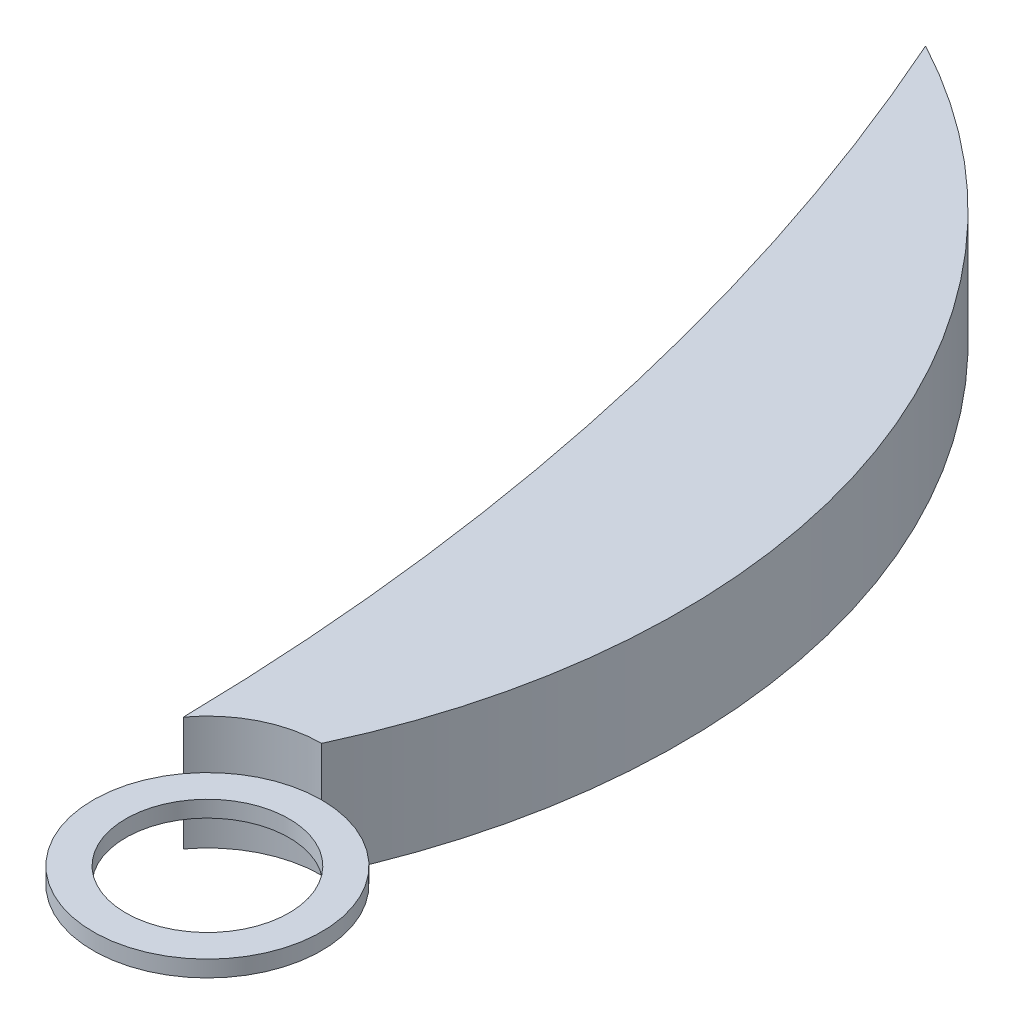
ISO-10303-21;
HEADER;
FILE_DESCRIPTION(('STEP AP214'),'2;1');
FILE_NAME('part.step','',(''),(''),'','','');
FILE_SCHEMA(('AUTOMOTIVE_DESIGN { 1 0 10303 214 1 1 1 1 }'));
ENDSEC;
DATA;
#1=APPLICATION_CONTEXT('core data for automotive mechanical design processes');
#2=APPLICATION_PROTOCOL_DEFINITION('international standard','automotive_design',2000,#1);
#3=PRODUCT_CONTEXT('',#1,'mechanical');
#4=PRODUCT('Part','Part','',(#3));
#5=PRODUCT_RELATED_PRODUCT_CATEGORY('part','',(#4));
#6=PRODUCT_DEFINITION_FORMATION('','',#4);
#7=PRODUCT_DEFINITION_CONTEXT('part definition',#1,'design');
#8=PRODUCT_DEFINITION('design','',#6,#7);
#9=PRODUCT_DEFINITION_SHAPE('','',#8);
#10=(LENGTH_UNIT() NAMED_UNIT(*) SI_UNIT(.MILLI.,.METRE.));
#11=(NAMED_UNIT(*) PLANE_ANGLE_UNIT() SI_UNIT($,.RADIAN.));
#12=(NAMED_UNIT(*) SI_UNIT($,.STERADIAN.) SOLID_ANGLE_UNIT());
#13=UNCERTAINTY_MEASURE_WITH_UNIT(LENGTH_MEASURE(1.E-05),#10,'distance_accuracy_value','');
#14=(GEOMETRIC_REPRESENTATION_CONTEXT(3) GLOBAL_UNCERTAINTY_ASSIGNED_CONTEXT((#13)) GLOBAL_UNIT_ASSIGNED_CONTEXT((#10,
#11,#12)) REPRESENTATION_CONTEXT('',''));
#15=CARTESIAN_POINT('',(0.,0.,0.));
#16=DIRECTION('',(0.,0.,1.));
#17=DIRECTION('',(1.,0.,0.));
#18=AXIS2_PLACEMENT_3D('',#15,#16,#17);
#19=CARTESIAN_POINT('',(-176.768164645197,215.9,-1290.65504752985));
#20=DIRECTION('',(0.,-1.,0.));
#21=DIRECTION('',(0.,0.,-1.));
#22=AXIS2_PLACEMENT_3D('',#19,#20,#21);
#23=CYLINDRICAL_SURFACE('',#22,76.2);
#24=CARTESIAN_POINT('',(-176.768164645197,172.357142857143,-1290.65504752985));
#25=DIRECTION('',(0.,-1.,0.));
#26=DIRECTION('',(0.,0.,-1.));
#27=AXIS2_PLACEMENT_3D('',#24,#25,#26);
#28=CIRCLE('',#27,76.2);
#29=CARTESIAN_POINT('',(-176.768164645197,172.357142857143,-1366.85504752985));
#30=VERTEX_POINT('',#29);
#31=CARTESIAN_POINT('',(-238.047360246343,172.357142857143,-1335.94632910232));
#32=VERTEX_POINT('',#31);
#33=EDGE_CURVE('E120',#30,#32,#28,.T.);
#34=ORIENTED_EDGE('',*,*,#33,.F.);
#35=DIRECTION('',(0.,-1.,0.));
#36=VECTOR('',#35,1.);
#37=CARTESIAN_POINT('',(-176.768164645197,215.9,-1366.85504752985));
#38=LINE('',#37,#36);
#39=CARTESIAN_POINT('',(-176.768164645197,183.242857142857,-1366.85504752985));
#40=VERTEX_POINT('',#39);
#41=EDGE_CURVE('E90',#40,#30,#38,.T.);
#42=ORIENTED_EDGE('',*,*,#41,.F.);
#43=CARTESIAN_POINT('',(-176.768164645197,183.242857142857,-1290.65504752985));
#44=DIRECTION('',(0.,1.,0.));
#45=DIRECTION('',(0.,0.,1.));
#46=AXIS2_PLACEMENT_3D('',#43,#44,#45);
#47=CIRCLE('',#46,76.2);
#48=CARTESIAN_POINT('',(-238.047360246343,183.242857142857,-1335.94632910232));
#49=VERTEX_POINT('',#48);
#50=EDGE_CURVE('E108',#49,#40,#47,.T.);
#51=ORIENTED_EDGE('',*,*,#50,.F.);
#52=DIRECTION('',(0.,-1.,0.));
#53=VECTOR('',#52,1.);
#54=CARTESIAN_POINT('',(-238.047360246343,215.9,-1335.94632910232));
#55=LINE('',#54,#53);
#56=EDGE_CURVE('E105',#49,#32,#55,.T.);
#57=ORIENTED_EDGE('',*,*,#56,.T.);
#58=EDGE_LOOP('',(#34,#42,#51,#57));
#59=FACE_BOUND('',#58,.T.);
#60=ADVANCED_FACE('F36',(#59),#23,.T.);
#61=CARTESIAN_POINT('',(-595.868164645197,215.9,-1562.79790467271));
#62=DIRECTION('',(0.,-1.,0.));
#63=DIRECTION('',(0.,0.,-1.));
#64=AXIS2_PLACEMENT_3D('',#61,#62,#63);
#65=CYLINDRICAL_SURFACE('',#64,462.642857142857);
#66=CARTESIAN_POINT('',(-595.868164645197,139.7,-1562.79790467271));
#67=DIRECTION('',(0.,1.,0.));
#68=DIRECTION('',(0.,0.,1.));
#69=AXIS2_PLACEMENT_3D('',#66,#67,#68);
#70=CIRCLE('',#69,462.642857142857);
#71=CARTESIAN_POINT('',(-176.768164645197,139.7,-1366.85504752985));
#72=VERTEX_POINT('',#71);
#73=CARTESIAN_POINT('',(-378.153878930911,139.7,-1971.01219038699));
#74=VERTEX_POINT('',#73);
#75=EDGE_CURVE('E96',#72,#74,#70,.T.);
#76=ORIENTED_EDGE('',*,*,#75,.T.);
#77=DIRECTION('',(0.,-1.,0.));
#78=VECTOR('',#77,1.);
#79=CARTESIAN_POINT('',(-378.153878930911,215.9,-1971.01219038699));
#80=LINE('',#79,#78);
#81=CARTESIAN_POINT('',(-378.153878930911,215.9,-1971.01219038699));
#82=VERTEX_POINT('',#81);
#83=EDGE_CURVE('E79',#82,#74,#80,.T.);
#84=ORIENTED_EDGE('',*,*,#83,.F.);
#85=CARTESIAN_POINT('',(-595.868164645197,215.9,-1562.79790467271));
#86=DIRECTION('',(0.,1.,0.));
#87=DIRECTION('',(0.,0.,1.));
#88=AXIS2_PLACEMENT_3D('',#85,#86,#87);
#89=CIRCLE('',#88,462.642857142857);
#90=CARTESIAN_POINT('',(-176.768164645197,215.9,-1366.85504752985));
#91=VERTEX_POINT('',#90);
#92=EDGE_CURVE('E102',#91,#82,#89,.T.);
#93=ORIENTED_EDGE('',*,*,#92,.F.);
#94=EDGE_CURVE('E45',#91,#40,#38,.T.);
#95=ORIENTED_EDGE('',*,*,#94,.T.);
#96=ORIENTED_EDGE('',*,*,#41,.T.);
#97=DIRECTION('',(0.,-1.,0.));
#98=VECTOR('',#97,1.);
#99=CARTESIAN_POINT('',(-176.768164645197,156.028571428571,-1366.85504752985));
#100=LINE('',#99,#98);
#101=EDGE_CURVE('E101',#30,#72,#100,.T.);
#102=ORIENTED_EDGE('',*,*,#101,.T.);
#103=EDGE_LOOP('',(#76,#84,#93,#95,#96,#102));
#104=FACE_BOUND('',#103,.T.);
#105=ADVANCED_FACE('F99',(#104),#65,.T.);
#106=CARTESIAN_POINT('',(-176.768164645197,215.9,-1290.65504752985));
#107=DIRECTION('',(0.,1.,0.));
#108=DIRECTION('',(0.,0.,1.));
#109=AXIS2_PLACEMENT_3D('',#106,#107,#108);
#110=PLANE('',#109);
#111=CARTESIAN_POINT('',(-1870.67796184236,215.9,-1308.74765796136));
#112=DIRECTION('',(0.,1.,0.));
#113=DIRECTION('',(0.,0.,1.));
#114=AXIS2_PLACEMENT_3D('',#111,#112,#113);
#115=CIRCLE('',#114,1632.85714285714);
#116=CARTESIAN_POINT('',(-238.047360246343,215.9,-1335.94632910232));
#117=VERTEX_POINT('',#116);
#118=EDGE_CURVE('E85',#117,#82,#115,.T.);
#119=ORIENTED_EDGE('',*,*,#118,.F.);
#120=CARTESIAN_POINT('',(-176.768164645197,215.9,-1290.65504752985));
#121=DIRECTION('',(0.,1.,0.));
#122=DIRECTION('',(0.,0.,1.));
#123=AXIS2_PLACEMENT_3D('',#120,#121,#122);
#124=CIRCLE('',#123,76.2);
#125=EDGE_CURVE('E131',#91,#117,#124,.T.);
#126=ORIENTED_EDGE('',*,*,#125,.F.);
#127=ORIENTED_EDGE('',*,*,#92,.T.);
#128=EDGE_LOOP('',(#119,#126,#127));
#129=FACE_BOUND('',#128,.T.);
#130=ADVANCED_FACE('F136',(#129),#110,.T.);
#131=CARTESIAN_POINT('',(-176.768164645197,139.7,-1290.65504752985));
#132=DIRECTION('',(0.,1.,0.));
#133=DIRECTION('',(0.,0.,1.));
#134=AXIS2_PLACEMENT_3D('',#131,#132,#133);
#135=PLANE('',#134);
#136=CARTESIAN_POINT('',(-176.768164645197,139.7,-1290.65504752985));
#137=DIRECTION('',(0.,1.,0.));
#138=DIRECTION('',(0.,0.,1.));
#139=AXIS2_PLACEMENT_3D('',#136,#137,#138);
#140=CIRCLE('',#139,76.2);
#141=CARTESIAN_POINT('',(-238.047360246343,139.7,-1335.94632910232));
#142=VERTEX_POINT('',#141);
#143=EDGE_CURVE('E11',#72,#142,#140,.T.);
#144=ORIENTED_EDGE('',*,*,#143,.T.);
#145=CARTESIAN_POINT('',(-1870.67796184236,139.7,-1308.74765796136));
#146=DIRECTION('',(0.,-1.,0.));
#147=DIRECTION('',(0.,0.,-1.));
#148=AXIS2_PLACEMENT_3D('',#145,#146,#147);
#149=CIRCLE('',#148,1632.85714285714);
#150=EDGE_CURVE('E82',#74,#142,#149,.T.);
#151=ORIENTED_EDGE('',*,*,#150,.F.);
#152=ORIENTED_EDGE('',*,*,#75,.F.);
#153=EDGE_LOOP('',(#144,#151,#152));
#154=FACE_BOUND('',#153,.T.);
#155=ADVANCED_FACE('F95',(#154),#135,.F.);
#156=CARTESIAN_POINT('',(-176.768164645197,183.242857142857,-1290.65504752985));
#157=DIRECTION('',(0.,1.,0.));
#158=DIRECTION('',(0.,0.,1.));
#159=AXIS2_PLACEMENT_3D('',#156,#157,#158);
#160=CYLINDRICAL_SURFACE('',#159,76.2);
#161=ORIENTED_EDGE('',*,*,#125,.T.);
#162=EDGE_CURVE('E91',#117,#49,#55,.T.);
#163=ORIENTED_EDGE('',*,*,#162,.T.);
#164=EDGE_CURVE('E103',#40,#49,#47,.T.);
#165=ORIENTED_EDGE('',*,*,#164,.F.);
#166=ORIENTED_EDGE('',*,*,#94,.F.);
#167=EDGE_LOOP('',(#161,#163,#165,#166));
#168=FACE_BOUND('',#167,.T.);
#169=ADVANCED_FACE('F134',(#168),#160,.F.);
#170=CARTESIAN_POINT('',(-176.768164645197,183.242857142857,-1290.65504752985));
#171=DIRECTION('',(0.,1.,0.));
#172=DIRECTION('',(0.,0.,1.));
#173=AXIS2_PLACEMENT_3D('',#170,#171,#172);
#174=PLANE('',#173);
#175=CARTESIAN_POINT('',(-176.768164645197,183.242857142857,-1290.65504752985));
#176=DIRECTION('',(0.,1.,0.));
#177=DIRECTION('',(0.,0.,1.));
#178=AXIS2_PLACEMENT_3D('',#175,#176,#177);
#179=CIRCLE('',#178,54.4285714285714);
#180=CARTESIAN_POINT('',(-176.768164645197,183.242857142857,-1236.22647610128));
#181=VERTEX_POINT('',#180);
#182=EDGE_CURVE('E128',#181,#181,#179,.T.);
#183=ORIENTED_EDGE('',*,*,#182,.F.);
#184=EDGE_LOOP('',(#183));
#185=FACE_BOUND('',#184,.T.);
#186=ORIENTED_EDGE('',*,*,#164,.T.);
#187=ORIENTED_EDGE('',*,*,#50,.T.);
#188=EDGE_LOOP('',(#186,#187));
#189=FACE_BOUND('',#188,.T.);
#190=ADVANCED_FACE('F133',(#185,#189),#174,.T.);
#191=CARTESIAN_POINT('',(-176.768164645197,172.357142857143,-1290.65504752985));
#192=DIRECTION('',(0.,-1.,0.));
#193=DIRECTION('',(0.,0.,-1.));
#194=AXIS2_PLACEMENT_3D('',#191,#192,#193);
#195=CYLINDRICAL_SURFACE('',#194,76.2);
#196=EDGE_CURVE('E124',#32,#30,#28,.T.);
#197=ORIENTED_EDGE('',*,*,#196,.F.);
#198=DIRECTION('',(0.,-1.,0.));
#199=VECTOR('',#198,1.);
#200=CARTESIAN_POINT('',(-238.047360246343,156.028571428571,-1335.94632910232));
#201=LINE('',#200,#199);
#202=EDGE_CURVE('E123',#142,#32,#201,.F.);
#203=ORIENTED_EDGE('',*,*,#202,.F.);
#204=ORIENTED_EDGE('',*,*,#143,.F.);
#205=ORIENTED_EDGE('',*,*,#101,.F.);
#206=EDGE_LOOP('',(#197,#203,#204,#205));
#207=FACE_BOUND('',#206,.T.);
#208=ADVANCED_FACE('F147',(#207),#195,.F.);
#209=CARTESIAN_POINT('',(-176.768164645197,172.357142857143,-1290.65504752985));
#210=DIRECTION('',(0.,-1.,0.));
#211=DIRECTION('',(0.,0.,-1.));
#212=AXIS2_PLACEMENT_3D('',#209,#210,#211);
#213=PLANE('',#212);
#214=CARTESIAN_POINT('',(-176.768164645197,172.357142857143,-1290.65504752985));
#215=DIRECTION('',(0.,-1.,0.));
#216=DIRECTION('',(0.,0.,-1.));
#217=AXIS2_PLACEMENT_3D('',#214,#215,#216);
#218=CIRCLE('',#217,54.4285714285714);
#219=CARTESIAN_POINT('',(-176.768164645197,172.357142857143,-1236.22647610128));
#220=VERTEX_POINT('',#219);
#221=EDGE_CURVE('E39',#220,#220,#218,.T.);
#222=ORIENTED_EDGE('',*,*,#221,.F.);
#223=EDGE_LOOP('',(#222));
#224=FACE_BOUND('',#223,.T.);
#225=ORIENTED_EDGE('',*,*,#33,.T.);
#226=ORIENTED_EDGE('',*,*,#196,.T.);
#227=EDGE_LOOP('',(#225,#226));
#228=FACE_BOUND('',#227,.T.);
#229=ADVANCED_FACE('F145',(#224,#228),#213,.T.);
#230=CARTESIAN_POINT('',(-176.768164645197,150.585714285714,-1290.65504752985));
#231=DIRECTION('',(0.,1.,0.));
#232=DIRECTION('',(0.,0.,1.));
#233=AXIS2_PLACEMENT_3D('',#230,#231,#232);
#234=CYLINDRICAL_SURFACE('',#233,54.4285714285714);
#235=CARTESIAN_POINT('',(-176.768164645197,172.357142857143,-1236.22647610128));
#236=CARTESIAN_POINT('',(-176.768164645197,172.470535714286,-1236.22647610128));
#237=CARTESIAN_POINT('',(-176.768164645197,172.583928571429,-1236.22647610128));
#238=CARTESIAN_POINT('',(-176.768164645197,172.810714285714,-1236.22647610128));
#239=CARTESIAN_POINT('',(-176.768164645197,172.924107142857,-1236.22647610128));
#240=CARTESIAN_POINT('',(-176.768164645197,173.150892857143,-1236.22647610128));
#241=CARTESIAN_POINT('',(-176.768164645197,173.264285714286,-1236.22647610128));
#242=CARTESIAN_POINT('',(-176.768164645197,173.491071428571,-1236.22647610128));
#243=CARTESIAN_POINT('',(-176.768164645197,173.604464285714,-1236.22647610128));
#244=CARTESIAN_POINT('',(-176.768164645197,173.83125,-1236.22647610128));
#245=CARTESIAN_POINT('',(-176.768164645197,173.944642857143,-1236.22647610128));
#246=CARTESIAN_POINT('',(-176.768164645197,174.171428571429,-1236.22647610128));
#247=CARTESIAN_POINT('',(-176.768164645197,174.284821428571,-1236.22647610128));
#248=CARTESIAN_POINT('',(-176.768164645197,174.511607142857,-1236.22647610128));
#249=CARTESIAN_POINT('',(-176.768164645197,174.625,-1236.22647610128));
#250=CARTESIAN_POINT('',(-176.768164645197,174.851785714286,-1236.22647610128));
#251=CARTESIAN_POINT('',(-176.768164645197,174.965178571429,-1236.22647610128));
#252=CARTESIAN_POINT('',(-176.768164645197,175.191964285714,-1236.22647610128));
#253=CARTESIAN_POINT('',(-176.768164645197,175.305357142857,-1236.22647610128));
#254=CARTESIAN_POINT('',(-176.768164645197,175.532142857143,-1236.22647610128));
#255=CARTESIAN_POINT('',(-176.768164645197,175.645535714286,-1236.22647610128));
#256=CARTESIAN_POINT('',(-176.768164645197,175.872321428571,-1236.22647610128));
#257=CARTESIAN_POINT('',(-176.768164645197,175.985714285714,-1236.22647610128));
#258=CARTESIAN_POINT('',(-176.768164645197,176.2125,-1236.22647610128));
#259=CARTESIAN_POINT('',(-176.768164645197,176.325892857143,-1236.22647610128));
#260=CARTESIAN_POINT('',(-176.768164645197,176.552678571429,-1236.22647610128));
#261=CARTESIAN_POINT('',(-176.768164645197,176.666071428571,-1236.22647610128));
#262=CARTESIAN_POINT('',(-176.768164645197,176.892857142857,-1236.22647610128));
#263=CARTESIAN_POINT('',(-176.768164645197,177.00625,-1236.22647610128));
#264=CARTESIAN_POINT('',(-176.768164645197,177.233035714286,-1236.22647610128));
#265=CARTESIAN_POINT('',(-176.768164645197,177.346428571429,-1236.22647610128));
#266=CARTESIAN_POINT('',(-176.768164645197,177.573214285714,-1236.22647610128));
#267=CARTESIAN_POINT('',(-176.768164645197,177.686607142857,-1236.22647610128));
#268=CARTESIAN_POINT('',(-176.768164645197,177.913392857143,-1236.22647610128));
#269=CARTESIAN_POINT('',(-176.768164645197,178.026785714286,-1236.22647610128));
#270=CARTESIAN_POINT('',(-176.768164645197,178.253571428571,-1236.22647610128));
#271=CARTESIAN_POINT('',(-176.768164645197,178.366964285714,-1236.22647610128));
#272=CARTESIAN_POINT('',(-176.768164645197,178.59375,-1236.22647610128));
#273=CARTESIAN_POINT('',(-176.768164645197,178.707142857143,-1236.22647610128));
#274=CARTESIAN_POINT('',(-176.768164645197,178.933928571429,-1236.22647610128));
#275=CARTESIAN_POINT('',(-176.768164645197,179.047321428571,-1236.22647610128));
#276=CARTESIAN_POINT('',(-176.768164645197,179.274107142857,-1236.22647610128));
#277=CARTESIAN_POINT('',(-176.768164645197,179.3875,-1236.22647610128));
#278=CARTESIAN_POINT('',(-176.768164645197,179.614285714286,-1236.22647610128));
#279=CARTESIAN_POINT('',(-176.768164645197,179.727678571429,-1236.22647610128));
#280=CARTESIAN_POINT('',(-176.768164645197,179.954464285714,-1236.22647610128));
#281=CARTESIAN_POINT('',(-176.768164645197,180.067857142857,-1236.22647610128));
#282=CARTESIAN_POINT('',(-176.768164645197,180.294642857143,-1236.22647610128));
#283=CARTESIAN_POINT('',(-176.768164645197,180.408035714286,-1236.22647610128));
#284=CARTESIAN_POINT('',(-176.768164645197,180.634821428571,-1236.22647610128));
#285=CARTESIAN_POINT('',(-176.768164645197,180.748214285714,-1236.22647610128));
#286=CARTESIAN_POINT('',(-176.768164645197,180.975,-1236.22647610128));
#287=CARTESIAN_POINT('',(-176.768164645197,181.088392857143,-1236.22647610128));
#288=CARTESIAN_POINT('',(-176.768164645197,181.315178571429,-1236.22647610128));
#289=CARTESIAN_POINT('',(-176.768164645197,181.428571428571,-1236.22647610128));
#290=CARTESIAN_POINT('',(-176.768164645197,181.655357142857,-1236.22647610128));
#291=CARTESIAN_POINT('',(-176.768164645197,181.76875,-1236.22647610128));
#292=CARTESIAN_POINT('',(-176.768164645197,181.995535714286,-1236.22647610128));
#293=CARTESIAN_POINT('',(-176.768164645197,182.108928571429,-1236.22647610128));
#294=CARTESIAN_POINT('',(-176.768164645197,182.335714285714,-1236.22647610128));
#295=CARTESIAN_POINT('',(-176.768164645197,182.449107142857,-1236.22647610128));
#296=CARTESIAN_POINT('',(-176.768164645197,182.675892857143,-1236.22647610128));
#297=CARTESIAN_POINT('',(-176.768164645197,182.789285714286,-1236.22647610128));
#298=CARTESIAN_POINT('',(-176.768164645197,183.016071428571,-1236.22647610128));
#299=CARTESIAN_POINT('',(-176.768164645197,183.129464285714,-1236.22647610128));
#300=CARTESIAN_POINT('',(-176.768164645197,183.242857142857,-1236.22647610128));
#301=B_SPLINE_CURVE_WITH_KNOTS('',3,(#235,#236,#237,#238,#239,#240,#241,#242,#243,#244,#245,
#246,#247,#248,#249,#250,#251,#252,#253,#254,#255,#256,#257,#258,#259,#260,#261,#262,#263,#264,
#265,#266,#267,#268,#269,#270,#271,#272,#273,#274,#275,#276,#277,#278,#279,#280,#281,#282,#283,
#284,#285,#286,#287,#288,#289,#290,#291,#292,#293,#294,#295,#296,#297,#298,#299,#300),
.UNSPECIFIED.,.F.,.F.,(4,2,2,2,2,2,2,2,2,2,2,2,2,2,2,2,2,2,2,2,2,2,2,2,2,2,2,2,2,2,2,2,4),(0.,
0.340178571428568,0.680357142857163,1.02053571428573,1.3607142857143,1.70089285714287,
2.04107142857143,2.38125,2.72142857142857,3.06160714285714,3.4017857142857,3.7419642857143,
4.08214285714287,4.42232142857144,4.7625,5.10267857142857,5.44285714285714,5.78303571428571,
6.12321428571427,6.46339285714284,6.80357142857144,7.14375,7.48392857142857,7.82410714285714,
8.16428571428571,8.50446428571427,8.84464285714284,9.18482142857141,9.52499999999998,
9.86517857142857,10.2053571428571,10.5455357142857,10.8857142857143),.UNSPECIFIED.);
#302=EDGE_CURVE('BSEAM143',#220,#181,#301,.T.);
#303=ORIENTED_EDGE('',*,*,#221,.T.);
#304=ORIENTED_EDGE('',*,*,#182,.T.);
#305=ORIENTED_EDGE('',*,*,#302,.T.);
#306=ORIENTED_EDGE('',*,*,#302,.F.);
#307=EDGE_LOOP('',(#303,#305,#304,#306));
#308=FACE_BOUND('',#307,.T.);
#309=ADVANCED_FACE('F143',(#308),#234,.F.);
#310=CARTESIAN_POINT('',(-1870.67796184236,275.771428571429,-1308.74765796136));
#311=DIRECTION('',(0.,-1.,0.));
#312=DIRECTION('',(0.,0.,-1.));
#313=AXIS2_PLACEMENT_3D('',#310,#311,#312);
#314=CYLINDRICAL_SURFACE('',#313,1632.85714285714);
#315=ORIENTED_EDGE('',*,*,#118,.T.);
#316=ORIENTED_EDGE('',*,*,#83,.T.);
#317=ORIENTED_EDGE('',*,*,#150,.T.);
#318=ORIENTED_EDGE('',*,*,#202,.T.);
#319=ORIENTED_EDGE('',*,*,#56,.F.);
#320=ORIENTED_EDGE('',*,*,#162,.F.);
#321=EDGE_LOOP('',(#315,#316,#317,#318,#319,#320));
#322=FACE_BOUND('',#321,.T.);
#323=ADVANCED_FACE('F81',(#322),#314,.F.);
#324=CLOSED_SHELL('',(#60,#105,#130,#155,#169,#190,#208,#229,#309,#323));
#325=MANIFOLD_SOLID_BREP('B2',#324);
#326=ADVANCED_BREP_SHAPE_REPRESENTATION('',(#18,#325),#14);
#327=SHAPE_DEFINITION_REPRESENTATION(#9,#326);
ENDSEC;
END-ISO-10303-21;
